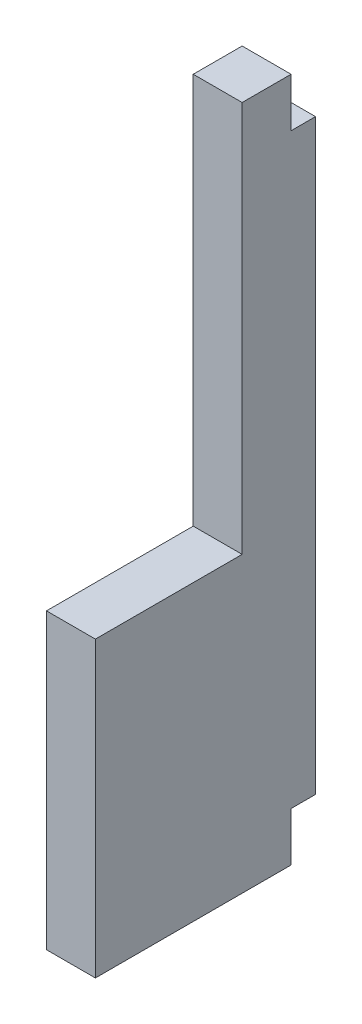
ISO-10303-21;
HEADER;
FILE_DESCRIPTION(('STEP AP214'),'2;1');
FILE_NAME('part.step','',(''),(''),'','','');
FILE_SCHEMA(('AUTOMOTIVE_DESIGN { 1 0 10303 214 1 1 1 1 }'));
ENDSEC;
DATA;
#1=APPLICATION_CONTEXT('core data for automotive mechanical design processes');
#2=APPLICATION_PROTOCOL_DEFINITION('international standard','automotive_design',2000,#1);
#3=PRODUCT_CONTEXT('',#1,'mechanical');
#4=PRODUCT('Part','Part','',(#3));
#5=PRODUCT_RELATED_PRODUCT_CATEGORY('part','',(#4));
#6=PRODUCT_DEFINITION_FORMATION('','',#4);
#7=PRODUCT_DEFINITION_CONTEXT('part definition',#1,'design');
#8=PRODUCT_DEFINITION('design','',#6,#7);
#9=PRODUCT_DEFINITION_SHAPE('','',#8);
#10=(LENGTH_UNIT() NAMED_UNIT(*) SI_UNIT(.MILLI.,.METRE.));
#11=(NAMED_UNIT(*) PLANE_ANGLE_UNIT() SI_UNIT($,.RADIAN.));
#12=(NAMED_UNIT(*) SI_UNIT($,.STERADIAN.) SOLID_ANGLE_UNIT());
#13=UNCERTAINTY_MEASURE_WITH_UNIT(LENGTH_MEASURE(1.E-05),#10,'distance_accuracy_value','');
#14=(GEOMETRIC_REPRESENTATION_CONTEXT(3) GLOBAL_UNCERTAINTY_ASSIGNED_CONTEXT((#13)) GLOBAL_UNIT_ASSIGNED_CONTEXT((#10,
#11,#12)) REPRESENTATION_CONTEXT('',''));
#15=CARTESIAN_POINT('',(0.,0.,0.));
#16=DIRECTION('',(0.,0.,1.));
#17=DIRECTION('',(1.,0.,0.));
#18=AXIS2_PLACEMENT_3D('',#15,#16,#17);
#19=CARTESIAN_POINT('',(10.,0.,30.));
#20=DIRECTION('',(0.,-1.,0.));
#21=DIRECTION('',(0.,0.,-1.));
#22=AXIS2_PLACEMENT_3D('',#19,#20,#21);
#23=PLANE('',#22);
#24=DIRECTION('',(0.,0.,1.));
#25=VECTOR('',#24,1.);
#26=CARTESIAN_POINT('',(0.,0.,30.));
#27=LINE('',#26,#25);
#28=CARTESIAN_POINT('',(0.,0.,0.));
#29=VERTEX_POINT('',#28);
#30=CARTESIAN_POINT('',(0.,0.,30.));
#31=VERTEX_POINT('',#30);
#32=EDGE_CURVE('E152',#29,#31,#27,.T.);
#33=ORIENTED_EDGE('',*,*,#32,.T.);
#34=DIRECTION('',(-1.,0.,0.));
#35=VECTOR('',#34,1.);
#36=CARTESIAN_POINT('',(10.,0.,30.));
#37=LINE('',#36,#35);
#38=CARTESIAN_POINT('',(10.,0.,30.));
#39=VERTEX_POINT('',#38);
#40=EDGE_CURVE('E11',#39,#31,#37,.T.);
#41=ORIENTED_EDGE('',*,*,#40,.F.);
#42=DIRECTION('',(0.,0.,1.));
#43=VECTOR('',#42,1.);
#44=CARTESIAN_POINT('',(10.,0.,30.));
#45=LINE('',#44,#43);
#46=CARTESIAN_POINT('',(10.,0.,0.));
#47=VERTEX_POINT('',#46);
#48=EDGE_CURVE('E180',#47,#39,#45,.T.);
#49=ORIENTED_EDGE('',*,*,#48,.F.);
#50=DIRECTION('',(-1.,0.,0.));
#51=VECTOR('',#50,1.);
#52=CARTESIAN_POINT('',(10.,0.,0.));
#53=LINE('',#52,#51);
#54=EDGE_CURVE('E148',#47,#29,#53,.T.);
#55=ORIENTED_EDGE('',*,*,#54,.T.);
#56=EDGE_LOOP('',(#33,#41,#49,#55));
#57=FACE_BOUND('',#56,.T.);
#58=ADVANCED_FACE('F39',(#57),#23,.F.);
#59=CARTESIAN_POINT('',(10.,-60.,30.));
#60=DIRECTION('',(0.,0.,-1.));
#61=DIRECTION('',(-1.,0.,0.));
#62=AXIS2_PLACEMENT_3D('',#59,#60,#61);
#63=PLANE('',#62);
#64=DIRECTION('',(0.,-1.,0.));
#65=VECTOR('',#64,1.);
#66=CARTESIAN_POINT('',(0.,-60.,30.));
#67=LINE('',#66,#65);
#68=CARTESIAN_POINT('',(0.,-60.,30.));
#69=VERTEX_POINT('',#68);
#70=EDGE_CURVE('E156',#31,#69,#67,.T.);
#71=ORIENTED_EDGE('',*,*,#70,.T.);
#72=DIRECTION('',(-1.,0.,0.));
#73=VECTOR('',#72,1.);
#74=CARTESIAN_POINT('',(10.,-60.,30.));
#75=LINE('',#74,#73);
#76=CARTESIAN_POINT('',(10.,-60.,30.));
#77=VERTEX_POINT('',#76);
#78=EDGE_CURVE('E48',#77,#69,#75,.T.);
#79=ORIENTED_EDGE('',*,*,#78,.F.);
#80=DIRECTION('',(0.,-1.,0.));
#81=VECTOR('',#80,1.);
#82=CARTESIAN_POINT('',(10.,-60.,30.));
#83=LINE('',#82,#81);
#84=EDGE_CURVE('E105',#39,#77,#83,.T.);
#85=ORIENTED_EDGE('',*,*,#84,.F.);
#86=ORIENTED_EDGE('',*,*,#40,.T.);
#87=EDGE_LOOP('',(#71,#79,#85,#86));
#88=FACE_BOUND('',#87,.T.);
#89=ADVANCED_FACE('F244',(#88),#63,.F.);
#90=CARTESIAN_POINT('',(10.,-60.,-10.));
#91=DIRECTION('',(0.,1.,0.));
#92=DIRECTION('',(0.,0.,1.));
#93=AXIS2_PLACEMENT_3D('',#90,#91,#92);
#94=PLANE('',#93);
#95=DIRECTION('',(0.,0.,-1.));
#96=VECTOR('',#95,1.);
#97=CARTESIAN_POINT('',(0.,-60.,-10.));
#98=LINE('',#97,#96);
#99=CARTESIAN_POINT('',(0.,-60.,-10.));
#100=VERTEX_POINT('',#99);
#101=EDGE_CURVE('E159',#69,#100,#98,.T.);
#102=ORIENTED_EDGE('',*,*,#101,.T.);
#103=DIRECTION('',(-1.,0.,0.));
#104=VECTOR('',#103,1.);
#105=CARTESIAN_POINT('',(10.,-60.,-10.));
#106=LINE('',#105,#104);
#107=CARTESIAN_POINT('',(10.,-60.,-10.));
#108=VERTEX_POINT('',#107);
#109=EDGE_CURVE('E199',#108,#100,#106,.T.);
#110=ORIENTED_EDGE('',*,*,#109,.F.);
#111=DIRECTION('',(0.,0.,-1.));
#112=VECTOR('',#111,1.);
#113=CARTESIAN_POINT('',(10.,-60.,-10.));
#114=LINE('',#113,#112);
#115=EDGE_CURVE('E209',#77,#108,#114,.T.);
#116=ORIENTED_EDGE('',*,*,#115,.F.);
#117=ORIENTED_EDGE('',*,*,#78,.T.);
#118=EDGE_LOOP('',(#102,#110,#116,#117));
#119=FACE_BOUND('',#118,.T.);
#120=ADVANCED_FACE('F207',(#119),#94,.F.);
#121=CARTESIAN_POINT('',(10.,-50.,-10.));
#122=DIRECTION('',(0.,0.,1.));
#123=DIRECTION('',(0.,-1.,0.));
#124=AXIS2_PLACEMENT_3D('',#121,#122,#123);
#125=PLANE('',#124);
#126=DIRECTION('',(0.,1.,0.));
#127=VECTOR('',#126,1.);
#128=CARTESIAN_POINT('',(0.,-50.,-10.));
#129=LINE('',#128,#127);
#130=CARTESIAN_POINT('',(0.,-50.,-10.));
#131=VERTEX_POINT('',#130);
#132=EDGE_CURVE('E162',#100,#131,#129,.T.);
#133=ORIENTED_EDGE('',*,*,#132,.T.);
#134=DIRECTION('',(-1.,0.,0.));
#135=VECTOR('',#134,1.);
#136=CARTESIAN_POINT('',(10.,-50.,-10.));
#137=LINE('',#136,#135);
#138=CARTESIAN_POINT('',(10.,-50.,-10.));
#139=VERTEX_POINT('',#138);
#140=EDGE_CURVE('E195',#139,#131,#137,.T.);
#141=ORIENTED_EDGE('',*,*,#140,.F.);
#142=DIRECTION('',(0.,1.,0.));
#143=VECTOR('',#142,1.);
#144=CARTESIAN_POINT('',(10.,-50.,-10.));
#145=LINE('',#144,#143);
#146=EDGE_CURVE('E228',#108,#139,#145,.T.);
#147=ORIENTED_EDGE('',*,*,#146,.F.);
#148=ORIENTED_EDGE('',*,*,#109,.T.);
#149=EDGE_LOOP('',(#133,#141,#147,#148));
#150=FACE_BOUND('',#149,.T.);
#151=ADVANCED_FACE('F218',(#150),#125,.F.);
#152=CARTESIAN_POINT('',(10.,-50.,-15.));
#153=DIRECTION('',(0.,1.,0.));
#154=DIRECTION('',(0.,0.,1.));
#155=AXIS2_PLACEMENT_3D('',#152,#153,#154);
#156=PLANE('',#155);
#157=DIRECTION('',(0.,0.,-1.));
#158=VECTOR('',#157,1.);
#159=CARTESIAN_POINT('',(0.,-50.,-15.));
#160=LINE('',#159,#158);
#161=CARTESIAN_POINT('',(0.,-50.,-15.));
#162=VERTEX_POINT('',#161);
#163=EDGE_CURVE('E165',#131,#162,#160,.T.);
#164=ORIENTED_EDGE('',*,*,#163,.T.);
#165=DIRECTION('',(-1.,0.,0.));
#166=VECTOR('',#165,1.);
#167=CARTESIAN_POINT('',(10.,-50.,-15.));
#168=LINE('',#167,#166);
#169=CARTESIAN_POINT('',(10.,-50.,-15.));
#170=VERTEX_POINT('',#169);
#171=EDGE_CURVE('E191',#170,#162,#168,.T.);
#172=ORIENTED_EDGE('',*,*,#171,.F.);
#173=DIRECTION('',(0.,0.,-1.));
#174=VECTOR('',#173,1.);
#175=CARTESIAN_POINT('',(10.,-50.,-15.));
#176=LINE('',#175,#174);
#177=EDGE_CURVE('E224',#139,#170,#176,.T.);
#178=ORIENTED_EDGE('',*,*,#177,.F.);
#179=ORIENTED_EDGE('',*,*,#140,.T.);
#180=EDGE_LOOP('',(#164,#172,#178,#179));
#181=FACE_BOUND('',#180,.T.);
#182=ADVANCED_FACE('F222',(#181),#156,.F.);
#183=CARTESIAN_POINT('',(10.,70.,-15.));
#184=DIRECTION('',(0.,0.,1.));
#185=DIRECTION('',(0.,-1.,0.));
#186=AXIS2_PLACEMENT_3D('',#183,#184,#185);
#187=PLANE('',#186);
#188=DIRECTION('',(0.,1.,0.));
#189=VECTOR('',#188,1.);
#190=CARTESIAN_POINT('',(0.,70.,-15.));
#191=LINE('',#190,#189);
#192=CARTESIAN_POINT('',(0.,70.,-15.));
#193=VERTEX_POINT('',#192);
#194=EDGE_CURVE('E168',#162,#193,#191,.T.);
#195=ORIENTED_EDGE('',*,*,#194,.T.);
#196=DIRECTION('',(-1.,0.,0.));
#197=VECTOR('',#196,1.);
#198=CARTESIAN_POINT('',(10.,70.,-15.));
#199=LINE('',#198,#197);
#200=CARTESIAN_POINT('',(10.,70.,-15.));
#201=VERTEX_POINT('',#200);
#202=EDGE_CURVE('E187',#201,#193,#199,.T.);
#203=ORIENTED_EDGE('',*,*,#202,.F.);
#204=DIRECTION('',(0.,1.,0.));
#205=VECTOR('',#204,1.);
#206=CARTESIAN_POINT('',(10.,70.,-15.));
#207=LINE('',#206,#205);
#208=EDGE_CURVE('E227',#170,#201,#207,.T.);
#209=ORIENTED_EDGE('',*,*,#208,.F.);
#210=ORIENTED_EDGE('',*,*,#171,.T.);
#211=EDGE_LOOP('',(#195,#203,#209,#210));
#212=FACE_BOUND('',#211,.T.);
#213=ADVANCED_FACE('F256',(#212),#187,.F.);
#214=CARTESIAN_POINT('',(10.,70.,-10.));
#215=DIRECTION('',(0.,-1.,0.));
#216=DIRECTION('',(0.,0.,-1.));
#217=AXIS2_PLACEMENT_3D('',#214,#215,#216);
#218=PLANE('',#217);
#219=DIRECTION('',(0.,0.,1.));
#220=VECTOR('',#219,1.);
#221=CARTESIAN_POINT('',(0.,70.,-10.));
#222=LINE('',#221,#220);
#223=CARTESIAN_POINT('',(0.,70.,-10.));
#224=VERTEX_POINT('',#223);
#225=EDGE_CURVE('E171',#193,#224,#222,.T.);
#226=ORIENTED_EDGE('',*,*,#225,.T.);
#227=DIRECTION('',(-1.,0.,0.));
#228=VECTOR('',#227,1.);
#229=CARTESIAN_POINT('',(10.,70.,-10.));
#230=LINE('',#229,#228);
#231=CARTESIAN_POINT('',(10.,70.,-10.));
#232=VERTEX_POINT('',#231);
#233=EDGE_CURVE('E141',#232,#224,#230,.T.);
#234=ORIENTED_EDGE('',*,*,#233,.F.);
#235=DIRECTION('',(0.,0.,1.));
#236=VECTOR('',#235,1.);
#237=CARTESIAN_POINT('',(10.,70.,-10.));
#238=LINE('',#237,#236);
#239=EDGE_CURVE('E130',#201,#232,#238,.T.);
#240=ORIENTED_EDGE('',*,*,#239,.F.);
#241=ORIENTED_EDGE('',*,*,#202,.T.);
#242=EDGE_LOOP('',(#226,#234,#240,#241));
#243=FACE_BOUND('',#242,.T.);
#244=ADVANCED_FACE('F259',(#243),#218,.F.);
#245=CARTESIAN_POINT('',(10.,80.,-10.));
#246=DIRECTION('',(0.,0.,1.));
#247=DIRECTION('',(1.,0.,0.));
#248=AXIS2_PLACEMENT_3D('',#245,#246,#247);
#249=PLANE('',#248);
#250=DIRECTION('',(0.,1.,0.));
#251=VECTOR('',#250,1.);
#252=CARTESIAN_POINT('',(0.,80.,-10.));
#253=LINE('',#252,#251);
#254=CARTESIAN_POINT('',(0.,80.,-10.));
#255=VERTEX_POINT('',#254);
#256=EDGE_CURVE('E139',#224,#255,#253,.T.);
#257=ORIENTED_EDGE('',*,*,#256,.T.);
#258=DIRECTION('',(-1.,0.,0.));
#259=VECTOR('',#258,1.);
#260=CARTESIAN_POINT('',(10.,80.,-10.));
#261=LINE('',#260,#259);
#262=CARTESIAN_POINT('',(10.,80.,-10.));
#263=VERTEX_POINT('',#262);
#264=EDGE_CURVE('E136',#263,#255,#261,.T.);
#265=ORIENTED_EDGE('',*,*,#264,.F.);
#266=DIRECTION('',(0.,1.,0.));
#267=VECTOR('',#266,1.);
#268=CARTESIAN_POINT('',(10.,80.,-10.));
#269=LINE('',#268,#267);
#270=EDGE_CURVE('E124',#232,#263,#269,.T.);
#271=ORIENTED_EDGE('',*,*,#270,.F.);
#272=ORIENTED_EDGE('',*,*,#233,.T.);
#273=EDGE_LOOP('',(#257,#265,#271,#272));
#274=FACE_BOUND('',#273,.T.);
#275=ADVANCED_FACE('F137',(#274),#249,.F.);
#276=CARTESIAN_POINT('',(10.,80.,0.));
#277=DIRECTION('',(0.,-1.,0.));
#278=DIRECTION('',(0.,0.,-1.));
#279=AXIS2_PLACEMENT_3D('',#276,#277,#278);
#280=PLANE('',#279);
#281=DIRECTION('',(0.,0.,1.));
#282=VECTOR('',#281,1.);
#283=CARTESIAN_POINT('',(0.,80.,0.));
#284=LINE('',#283,#282);
#285=CARTESIAN_POINT('',(0.,80.,0.));
#286=VERTEX_POINT('',#285);
#287=EDGE_CURVE('E91',#255,#286,#284,.T.);
#288=ORIENTED_EDGE('',*,*,#287,.T.);
#289=DIRECTION('',(-1.,0.,0.));
#290=VECTOR('',#289,1.);
#291=CARTESIAN_POINT('',(10.,80.,0.));
#292=LINE('',#291,#290);
#293=CARTESIAN_POINT('',(10.,80.,0.));
#294=VERTEX_POINT('',#293);
#295=EDGE_CURVE('E142',#294,#286,#292,.T.);
#296=ORIENTED_EDGE('',*,*,#295,.F.);
#297=DIRECTION('',(0.,0.,1.));
#298=VECTOR('',#297,1.);
#299=CARTESIAN_POINT('',(10.,80.,0.));
#300=LINE('',#299,#298);
#301=EDGE_CURVE('E128',#263,#294,#300,.T.);
#302=ORIENTED_EDGE('',*,*,#301,.F.);
#303=ORIENTED_EDGE('',*,*,#264,.T.);
#304=EDGE_LOOP('',(#288,#296,#302,#303));
#305=FACE_BOUND('',#304,.T.);
#306=ADVANCED_FACE('F144',(#305),#280,.F.);
#307=CARTESIAN_POINT('',(10.,0.,0.));
#308=DIRECTION('',(0.,0.,-1.));
#309=DIRECTION('',(-1.,0.,0.));
#310=AXIS2_PLACEMENT_3D('',#307,#308,#309);
#311=PLANE('',#310);
#312=DIRECTION('',(0.,-1.,0.));
#313=VECTOR('',#312,1.);
#314=CARTESIAN_POINT('',(0.,0.,0.));
#315=LINE('',#314,#313);
#316=EDGE_CURVE('E97',#286,#29,#315,.T.);
#317=ORIENTED_EDGE('',*,*,#316,.T.);
#318=ORIENTED_EDGE('',*,*,#54,.F.);
#319=DIRECTION('',(0.,-1.,0.));
#320=VECTOR('',#319,1.);
#321=CARTESIAN_POINT('',(10.,0.,0.));
#322=LINE('',#321,#320);
#323=EDGE_CURVE('E56',#294,#47,#322,.T.);
#324=ORIENTED_EDGE('',*,*,#323,.F.);
#325=ORIENTED_EDGE('',*,*,#295,.T.);
#326=EDGE_LOOP('',(#317,#318,#324,#325));
#327=FACE_BOUND('',#326,.T.);
#328=ADVANCED_FACE('F268',(#327),#311,.F.);
#329=CARTESIAN_POINT('',(10.,0.,0.));
#330=DIRECTION('',(1.,0.,0.));
#331=DIRECTION('',(0.,0.,-1.));
#332=AXIS2_PLACEMENT_3D('',#329,#330,#331);
#333=PLANE('',#332);
#334=ORIENTED_EDGE('',*,*,#48,.T.);
#335=ORIENTED_EDGE('',*,*,#84,.T.);
#336=ORIENTED_EDGE('',*,*,#115,.T.);
#337=ORIENTED_EDGE('',*,*,#146,.T.);
#338=ORIENTED_EDGE('',*,*,#177,.T.);
#339=ORIENTED_EDGE('',*,*,#208,.T.);
#340=ORIENTED_EDGE('',*,*,#239,.T.);
#341=ORIENTED_EDGE('',*,*,#270,.T.);
#342=ORIENTED_EDGE('',*,*,#301,.T.);
#343=ORIENTED_EDGE('',*,*,#323,.T.);
#344=EDGE_LOOP('',(#334,#335,#336,#337,#338,#339,#340,#341,#342,#343));
#345=FACE_BOUND('',#344,.T.);
#346=ADVANCED_FACE('F126',(#345),#333,.T.);
#347=CARTESIAN_POINT('',(0.,0.,0.));
#348=DIRECTION('',(1.,0.,0.));
#349=DIRECTION('',(0.,0.,-1.));
#350=AXIS2_PLACEMENT_3D('',#347,#348,#349);
#351=PLANE('',#350);
#352=ORIENTED_EDGE('',*,*,#32,.F.);
#353=ORIENTED_EDGE('',*,*,#316,.F.);
#354=ORIENTED_EDGE('',*,*,#287,.F.);
#355=ORIENTED_EDGE('',*,*,#256,.F.);
#356=ORIENTED_EDGE('',*,*,#225,.F.);
#357=ORIENTED_EDGE('',*,*,#194,.F.);
#358=ORIENTED_EDGE('',*,*,#163,.F.);
#359=ORIENTED_EDGE('',*,*,#132,.F.);
#360=ORIENTED_EDGE('',*,*,#101,.F.);
#361=ORIENTED_EDGE('',*,*,#70,.F.);
#362=EDGE_LOOP('',(#352,#353,#354,#355,#356,#357,#358,#359,#360,#361));
#363=FACE_BOUND('',#362,.T.);
#364=ADVANCED_FACE('F213',(#363),#351,.F.);
#365=CLOSED_SHELL('',(#58,#89,#120,#151,#182,#213,#244,#275,#306,#328,#346,#364));
#366=MANIFOLD_SOLID_BREP('B2',#365);
#367=ADVANCED_BREP_SHAPE_REPRESENTATION('',(#18,#366),#14);
#368=SHAPE_DEFINITION_REPRESENTATION(#9,#367);
ENDSEC;
END-ISO-10303-21;
